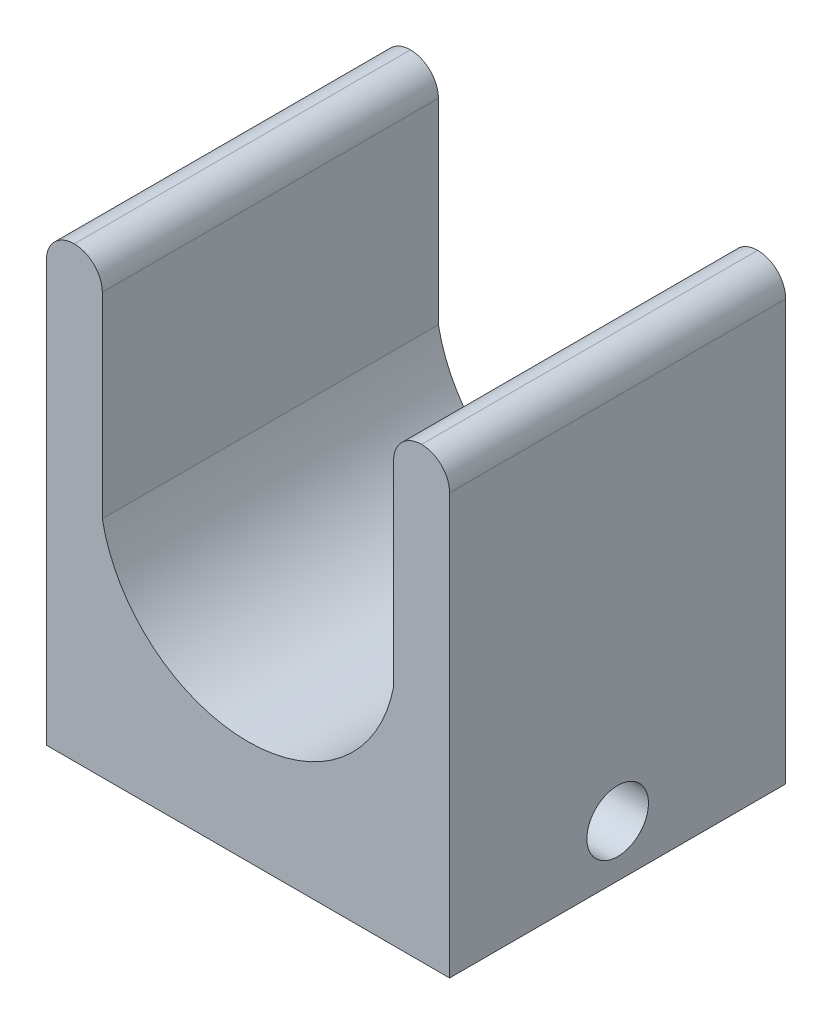
ISO-10303-21;
HEADER;
FILE_DESCRIPTION(('STEP AP214'),'2;1');
FILE_NAME('part.step','',(''),(''),'','','');
FILE_SCHEMA(('AUTOMOTIVE_DESIGN { 1 0 10303 214 1 1 1 1 }'));
ENDSEC;
DATA;
#1=APPLICATION_CONTEXT('core data for automotive mechanical design processes');
#2=APPLICATION_PROTOCOL_DEFINITION('international standard','automotive_design',2000,#1);
#3=PRODUCT_CONTEXT('',#1,'mechanical');
#4=PRODUCT('Part','Part','',(#3));
#5=PRODUCT_RELATED_PRODUCT_CATEGORY('part','',(#4));
#6=PRODUCT_DEFINITION_FORMATION('','',#4);
#7=PRODUCT_DEFINITION_CONTEXT('part definition',#1,'design');
#8=PRODUCT_DEFINITION('design','',#6,#7);
#9=PRODUCT_DEFINITION_SHAPE('','',#8);
#10=(LENGTH_UNIT() NAMED_UNIT(*) SI_UNIT(.MILLI.,.METRE.));
#11=(NAMED_UNIT(*) PLANE_ANGLE_UNIT() SI_UNIT($,.RADIAN.));
#12=(NAMED_UNIT(*) SI_UNIT($,.STERADIAN.) SOLID_ANGLE_UNIT());
#13=UNCERTAINTY_MEASURE_WITH_UNIT(LENGTH_MEASURE(1.E-05),#10,'distance_accuracy_value','');
#14=(GEOMETRIC_REPRESENTATION_CONTEXT(3) GLOBAL_UNCERTAINTY_ASSIGNED_CONTEXT((#13)) GLOBAL_UNIT_ASSIGNED_CONTEXT((#10,
#11,#12)) REPRESENTATION_CONTEXT('',''));
#15=CARTESIAN_POINT('',(0.,0.,0.));
#16=DIRECTION('',(0.,0.,1.));
#17=DIRECTION('',(1.,0.,0.));
#18=AXIS2_PLACEMENT_3D('',#15,#16,#17);
#19=CARTESIAN_POINT('',(-36.,5.66575903543038,60.));
#20=DIRECTION('',(1.,0.,0.));
#21=DIRECTION('',(0.,1.,0.));
#22=AXIS2_PLACEMENT_3D('',#19,#20,#21);
#23=PLANE('',#22);
#24=CARTESIAN_POINT('',(-36.,-25.0643109132314,30.));
#25=DIRECTION('',(1.,0.,0.));
#26=DIRECTION('',(0.,1.,0.));
#27=AXIS2_PLACEMENT_3D('',#24,#25,#26);
#28=CIRCLE('',#27,5.5);
#29=CARTESIAN_POINT('',(-36.,-19.5643109132314,30.));
#30=VERTEX_POINT('',#29);
#31=EDGE_CURVE('E192',#30,#30,#28,.T.);
#32=ORIENTED_EDGE('',*,*,#31,.T.);
#33=EDGE_LOOP('',(#32));
#34=FACE_BOUND('',#33,.T.);
#35=DIRECTION('',(0.,-1.,0.));
#36=VECTOR('',#35,1.);
#37=CARTESIAN_POINT('',(-36.,45.6657590354304,60.));
#38=LINE('',#37,#36);
#39=CARTESIAN_POINT('',(-36.,40.6657590354304,60.));
#40=VERTEX_POINT('',#39);
#41=CARTESIAN_POINT('',(-36.,-34.3342409645696,60.));
#42=VERTEX_POINT('',#41);
#43=EDGE_CURVE('E118',#40,#42,#38,.T.);
#44=ORIENTED_EDGE('',*,*,#43,.F.);
#45=DIRECTION('',(0.,0.,-1.));
#46=VECTOR('',#45,1.);
#47=CARTESIAN_POINT('',(-36.,40.6657590354304,60.));
#48=LINE('',#47,#46);
#49=CARTESIAN_POINT('',(-36.,40.6657590354304,0.));
#50=VERTEX_POINT('',#49);
#51=EDGE_CURVE('E11',#40,#50,#48,.T.);
#52=ORIENTED_EDGE('',*,*,#51,.T.);
#53=DIRECTION('',(0.,-1.,0.));
#54=VECTOR('',#53,1.);
#55=CARTESIAN_POINT('',(-36.,5.66575903543038,0.));
#56=LINE('',#55,#54);
#57=CARTESIAN_POINT('',(-36.,-34.3342409645696,0.));
#58=VERTEX_POINT('',#57);
#59=EDGE_CURVE('E134',#50,#58,#56,.T.);
#60=ORIENTED_EDGE('',*,*,#59,.T.);
#61=DIRECTION('',(0.,0.,-1.));
#62=VECTOR('',#61,1.);
#63=CARTESIAN_POINT('',(-36.,-34.3342409645696,60.));
#64=LINE('',#63,#62);
#65=EDGE_CURVE('E128',#42,#58,#64,.T.);
#66=ORIENTED_EDGE('',*,*,#65,.F.);
#67=EDGE_LOOP('',(#44,#52,#60,#66));
#68=FACE_BOUND('',#67,.T.);
#69=ADVANCED_FACE('F39',(#34,#68),#23,.F.);
#70=CARTESIAN_POINT('',(-36.,-34.3342409645696,60.));
#71=DIRECTION('',(0.,1.,0.));
#72=DIRECTION('',(0.,0.,1.));
#73=AXIS2_PLACEMENT_3D('',#70,#71,#72);
#74=PLANE('',#73);
#75=DIRECTION('',(1.,0.,0.));
#76=VECTOR('',#75,1.);
#77=CARTESIAN_POINT('',(-36.,-34.3342409645696,0.));
#78=LINE('',#77,#76);
#79=CARTESIAN_POINT('',(36.,-34.3342409645696,0.));
#80=VERTEX_POINT('',#79);
#81=EDGE_CURVE('E156',#58,#80,#78,.T.);
#82=ORIENTED_EDGE('',*,*,#81,.T.);
#83=DIRECTION('',(0.,0.,-1.));
#84=VECTOR('',#83,1.);
#85=CARTESIAN_POINT('',(36.,-34.3342409645696,60.));
#86=LINE('',#85,#84);
#87=CARTESIAN_POINT('',(36.,-34.3342409645696,60.));
#88=VERTEX_POINT('',#87);
#89=EDGE_CURVE('E140',#88,#80,#86,.T.);
#90=ORIENTED_EDGE('',*,*,#89,.F.);
#91=DIRECTION('',(1.,0.,0.));
#92=VECTOR('',#91,1.);
#93=CARTESIAN_POINT('',(-36.,-34.3342409645696,60.));
#94=LINE('',#93,#92);
#95=EDGE_CURVE('E123',#42,#88,#94,.T.);
#96=ORIENTED_EDGE('',*,*,#95,.F.);
#97=ORIENTED_EDGE('',*,*,#65,.T.);
#98=EDGE_LOOP('',(#82,#90,#96,#97));
#99=FACE_BOUND('',#98,.T.);
#100=ADVANCED_FACE('F139',(#99),#74,.F.);
#101=CARTESIAN_POINT('',(36.,45.6657590354304,60.));
#102=DIRECTION('',(-1.,0.,0.));
#103=DIRECTION('',(0.,-1.,0.));
#104=AXIS2_PLACEMENT_3D('',#101,#102,#103);
#105=PLANE('',#104);
#106=CARTESIAN_POINT('',(36.,-25.0643109132314,30.));
#107=DIRECTION('',(1.,0.,0.));
#108=DIRECTION('',(0.,1.,0.));
#109=AXIS2_PLACEMENT_3D('',#106,#107,#108);
#110=CIRCLE('',#109,5.5);
#111=CARTESIAN_POINT('',(36.,-19.5643109132314,30.));
#112=VERTEX_POINT('',#111);
#113=EDGE_CURVE('E200',#112,#112,#110,.T.);
#114=ORIENTED_EDGE('',*,*,#113,.F.);
#115=EDGE_LOOP('',(#114));
#116=FACE_BOUND('',#115,.T.);
#117=DIRECTION('',(0.,1.,0.));
#118=VECTOR('',#117,1.);
#119=CARTESIAN_POINT('',(36.,45.6657590354304,0.));
#120=LINE('',#119,#118);
#121=CARTESIAN_POINT('',(36.,40.6657590354304,0.));
#122=VERTEX_POINT('',#121);
#123=EDGE_CURVE('E157',#80,#122,#120,.T.);
#124=ORIENTED_EDGE('',*,*,#123,.T.);
#125=DIRECTION('',(0.,0.,-1.));
#126=VECTOR('',#125,1.);
#127=CARTESIAN_POINT('',(36.,40.6657590354304,60.));
#128=LINE('',#127,#126);
#129=CARTESIAN_POINT('',(36.,40.6657590354304,60.));
#130=VERTEX_POINT('',#129);
#131=EDGE_CURVE('E182',#122,#130,#128,.F.);
#132=ORIENTED_EDGE('',*,*,#131,.T.);
#133=DIRECTION('',(0.,1.,0.));
#134=VECTOR('',#133,1.);
#135=CARTESIAN_POINT('',(36.,-34.3342409645696,60.));
#136=LINE('',#135,#134);
#137=EDGE_CURVE('E142',#88,#130,#136,.T.);
#138=ORIENTED_EDGE('',*,*,#137,.F.);
#139=ORIENTED_EDGE('',*,*,#89,.T.);
#140=EDGE_LOOP('',(#124,#132,#138,#139));
#141=FACE_BOUND('',#140,.T.);
#142=ADVANCED_FACE('F208',(#116,#141),#105,.F.);
#143=CARTESIAN_POINT('',(26.,45.6657590354304,60.));
#144=DIRECTION('',(1.,0.,0.));
#145=DIRECTION('',(0.,1.,0.));
#146=AXIS2_PLACEMENT_3D('',#143,#144,#145);
#147=PLANE('',#146);
#148=DIRECTION('',(0.,-1.,0.));
#149=VECTOR('',#148,1.);
#150=CARTESIAN_POINT('',(26.,45.6657590354304,60.));
#151=LINE('',#150,#149);
#152=CARTESIAN_POINT('',(26.,40.6657590354304,60.));
#153=VERTEX_POINT('',#152);
#154=CARTESIAN_POINT('',(26.,5.66575903543036,60.));
#155=VERTEX_POINT('',#154);
#156=EDGE_CURVE('E145',#153,#155,#151,.T.);
#157=ORIENTED_EDGE('',*,*,#156,.F.);
#158=DIRECTION('',(0.,0.,-1.));
#159=VECTOR('',#158,1.);
#160=CARTESIAN_POINT('',(26.,40.6657590354304,60.));
#161=LINE('',#160,#159);
#162=CARTESIAN_POINT('',(26.,40.6657590354304,0.));
#163=VERTEX_POINT('',#162);
#164=EDGE_CURVE('E190',#153,#163,#161,.T.);
#165=ORIENTED_EDGE('',*,*,#164,.T.);
#166=DIRECTION('',(0.,-1.,0.));
#167=VECTOR('',#166,1.);
#168=CARTESIAN_POINT('',(26.,45.6657590354304,0.));
#169=LINE('',#168,#167);
#170=CARTESIAN_POINT('',(26.,5.66575903543036,0.));
#171=VERTEX_POINT('',#170);
#172=EDGE_CURVE('E165',#163,#171,#169,.T.);
#173=ORIENTED_EDGE('',*,*,#172,.T.);
#174=DIRECTION('',(0.,0.,-1.));
#175=VECTOR('',#174,1.);
#176=CARTESIAN_POINT('',(26.,5.66575903543036,60.));
#177=LINE('',#176,#175);
#178=EDGE_CURVE('E168',#155,#171,#177,.T.);
#179=ORIENTED_EDGE('',*,*,#178,.F.);
#180=EDGE_LOOP('',(#157,#165,#173,#179));
#181=FACE_BOUND('',#180,.T.);
#182=ADVANCED_FACE('F211',(#181),#147,.F.);
#183=CARTESIAN_POINT('',(0.,10.685819403587,60.));
#184=DIRECTION('',(0.,0.,-1.));
#185=DIRECTION('',(-1.,0.,0.));
#186=AXIS2_PLACEMENT_3D('',#183,#184,#185);
#187=CYLINDRICAL_SURFACE('',#186,26.4802002654802);
#188=CARTESIAN_POINT('',(0.,10.685819403587,0.));
#189=DIRECTION('',(0.,0.,-1.));
#190=DIRECTION('',(1.,0.,0.));
#191=AXIS2_PLACEMENT_3D('',#188,#189,#190);
#192=CIRCLE('',#191,26.4802002654802);
#193=CARTESIAN_POINT('',(-26.,5.66575903543038,0.));
#194=VERTEX_POINT('',#193);
#195=EDGE_CURVE('E163',#171,#194,#192,.T.);
#196=ORIENTED_EDGE('',*,*,#195,.T.);
#197=DIRECTION('',(0.,0.,-1.));
#198=VECTOR('',#197,1.);
#199=CARTESIAN_POINT('',(-26.,5.66575903543038,60.));
#200=LINE('',#199,#198);
#201=CARTESIAN_POINT('',(-26.,5.66575903543038,60.));
#202=VERTEX_POINT('',#201);
#203=EDGE_CURVE('E152',#202,#194,#200,.T.);
#204=ORIENTED_EDGE('',*,*,#203,.F.);
#205=CARTESIAN_POINT('',(0.,10.685819403587,60.));
#206=DIRECTION('',(0.,0.,-1.));
#207=DIRECTION('',(1.,0.,0.));
#208=AXIS2_PLACEMENT_3D('',#205,#206,#207);
#209=CIRCLE('',#208,26.4802002654802);
#210=EDGE_CURVE('E149',#155,#202,#209,.T.);
#211=ORIENTED_EDGE('',*,*,#210,.F.);
#212=ORIENTED_EDGE('',*,*,#178,.T.);
#213=EDGE_LOOP('',(#196,#204,#211,#212));
#214=FACE_BOUND('',#213,.T.);
#215=ADVANCED_FACE('F227',(#214),#187,.F.);
#216=CARTESIAN_POINT('',(-26.,45.6657590354304,60.));
#217=DIRECTION('',(-1.,0.,0.));
#218=DIRECTION('',(0.,-1.,0.));
#219=AXIS2_PLACEMENT_3D('',#216,#217,#218);
#220=PLANE('',#219);
#221=DIRECTION('',(0.,1.,0.));
#222=VECTOR('',#221,1.);
#223=CARTESIAN_POINT('',(-26.,45.6657590354304,0.));
#224=LINE('',#223,#222);
#225=CARTESIAN_POINT('',(-26.,40.6657590354304,0.));
#226=VERTEX_POINT('',#225);
#227=EDGE_CURVE('E130',#194,#226,#224,.T.);
#228=ORIENTED_EDGE('',*,*,#227,.T.);
#229=DIRECTION('',(0.,0.,-1.));
#230=VECTOR('',#229,1.);
#231=CARTESIAN_POINT('',(-26.,40.6657590354304,60.));
#232=LINE('',#231,#230);
#233=CARTESIAN_POINT('',(-26.,40.6657590354304,60.));
#234=VERTEX_POINT('',#233);
#235=EDGE_CURVE('E48',#226,#234,#232,.F.);
#236=ORIENTED_EDGE('',*,*,#235,.T.);
#237=DIRECTION('',(0.,1.,0.));
#238=VECTOR('',#237,1.);
#239=CARTESIAN_POINT('',(-26.,45.6657590354304,60.));
#240=LINE('',#239,#238);
#241=EDGE_CURVE('E151',#202,#234,#240,.T.);
#242=ORIENTED_EDGE('',*,*,#241,.F.);
#243=ORIENTED_EDGE('',*,*,#203,.T.);
#244=EDGE_LOOP('',(#228,#236,#242,#243));
#245=FACE_BOUND('',#244,.T.);
#246=ADVANCED_FACE('F235',(#245),#220,.F.);
#247=CARTESIAN_POINT('',(0.,10.685819403587,60.));
#248=DIRECTION('',(0.,0.,1.));
#249=DIRECTION('',(1.,0.,0.));
#250=AXIS2_PLACEMENT_3D('',#247,#248,#249);
#251=PLANE('',#250);
#252=ORIENTED_EDGE('',*,*,#137,.T.);
#253=CARTESIAN_POINT('',(31.,40.6657590354304,60.));
#254=DIRECTION('',(0.,0.,1.));
#255=DIRECTION('',(1.,0.,0.));
#256=AXIS2_PLACEMENT_3D('',#253,#254,#255);
#257=CIRCLE('',#256,5.);
#258=CARTESIAN_POINT('',(31.,45.6657590354304,60.));
#259=VERTEX_POINT('',#258);
#260=EDGE_CURVE('E189',#130,#259,#257,.T.);
#261=ORIENTED_EDGE('',*,*,#260,.T.);
#262=CARTESIAN_POINT('',(31.,40.6657590354304,60.));
#263=DIRECTION('',(0.,0.,1.));
#264=DIRECTION('',(1.,0.,0.));
#265=AXIS2_PLACEMENT_3D('',#262,#263,#264);
#266=CIRCLE('',#265,5.);
#267=EDGE_CURVE('E65',#259,#153,#266,.T.);
#268=ORIENTED_EDGE('',*,*,#267,.T.);
#269=ORIENTED_EDGE('',*,*,#156,.T.);
#270=ORIENTED_EDGE('',*,*,#210,.T.);
#271=ORIENTED_EDGE('',*,*,#241,.T.);
#272=CARTESIAN_POINT('',(-31.,40.6657590354304,60.));
#273=DIRECTION('',(0.,0.,1.));
#274=DIRECTION('',(1.,0.,0.));
#275=AXIS2_PLACEMENT_3D('',#272,#273,#274);
#276=CIRCLE('',#275,5.);
#277=CARTESIAN_POINT('',(-31.,45.6657590354304,60.));
#278=VERTEX_POINT('',#277);
#279=EDGE_CURVE('E57',#234,#278,#276,.T.);
#280=ORIENTED_EDGE('',*,*,#279,.T.);
#281=CARTESIAN_POINT('',(-31.,40.6657590354304,60.));
#282=DIRECTION('',(0.,0.,1.));
#283=DIRECTION('',(1.,0.,0.));
#284=AXIS2_PLACEMENT_3D('',#281,#282,#283);
#285=CIRCLE('',#284,5.);
#286=EDGE_CURVE('E124',#278,#40,#285,.T.);
#287=ORIENTED_EDGE('',*,*,#286,.T.);
#288=ORIENTED_EDGE('',*,*,#43,.T.);
#289=ORIENTED_EDGE('',*,*,#95,.T.);
#290=EDGE_LOOP('',(#252,#261,#268,#269,#270,#271,#280,#287,#288,#289));
#291=FACE_BOUND('',#290,.T.);
#292=ADVANCED_FACE('F120',(#291),#251,.T.);
#293=CARTESIAN_POINT('',(0.,10.685819403587,0.));
#294=DIRECTION('',(0.,0.,1.));
#295=DIRECTION('',(1.,0.,0.));
#296=AXIS2_PLACEMENT_3D('',#293,#294,#295);
#297=PLANE('',#296);
#298=CARTESIAN_POINT('',(31.,40.6657590354304,0.));
#299=DIRECTION('',(0.,0.,1.));
#300=DIRECTION('',(1.,0.,0.));
#301=AXIS2_PLACEMENT_3D('',#298,#299,#300);
#302=CIRCLE('',#301,5.);
#303=CARTESIAN_POINT('',(31.,45.6657590354304,0.));
#304=VERTEX_POINT('',#303);
#305=EDGE_CURVE('E180',#163,#304,#302,.F.);
#306=ORIENTED_EDGE('',*,*,#305,.T.);
#307=CARTESIAN_POINT('',(31.,40.6657590354304,0.));
#308=DIRECTION('',(0.,0.,1.));
#309=DIRECTION('',(1.,0.,0.));
#310=AXIS2_PLACEMENT_3D('',#307,#308,#309);
#311=CIRCLE('',#310,5.);
#312=EDGE_CURVE('E179',#304,#122,#311,.F.);
#313=ORIENTED_EDGE('',*,*,#312,.T.);
#314=ORIENTED_EDGE('',*,*,#123,.F.);
#315=ORIENTED_EDGE('',*,*,#81,.F.);
#316=ORIENTED_EDGE('',*,*,#59,.F.);
#317=CARTESIAN_POINT('',(-31.,40.6657590354304,0.));
#318=DIRECTION('',(0.,0.,1.));
#319=DIRECTION('',(1.,0.,0.));
#320=AXIS2_PLACEMENT_3D('',#317,#318,#319);
#321=CIRCLE('',#320,5.);
#322=CARTESIAN_POINT('',(-31.,45.6657590354304,0.));
#323=VERTEX_POINT('',#322);
#324=EDGE_CURVE('E138',#50,#323,#321,.F.);
#325=ORIENTED_EDGE('',*,*,#324,.T.);
#326=CARTESIAN_POINT('',(-31.,40.6657590354304,0.));
#327=DIRECTION('',(0.,0.,1.));
#328=DIRECTION('',(1.,0.,0.));
#329=AXIS2_PLACEMENT_3D('',#326,#327,#328);
#330=CIRCLE('',#329,5.);
#331=EDGE_CURVE('E171',#323,#226,#330,.F.);
#332=ORIENTED_EDGE('',*,*,#331,.T.);
#333=ORIENTED_EDGE('',*,*,#227,.F.);
#334=ORIENTED_EDGE('',*,*,#195,.F.);
#335=ORIENTED_EDGE('',*,*,#172,.F.);
#336=EDGE_LOOP('',(#306,#313,#314,#315,#316,#325,#332,#333,#334,#335));
#337=FACE_BOUND('',#336,.T.);
#338=ADVANCED_FACE('F221',(#337),#297,.F.);
#339=CARTESIAN_POINT('',(31.,40.6657590354304,60.));
#340=DIRECTION('',(0.,0.,-1.));
#341=DIRECTION('',(-1.,0.,0.));
#342=AXIS2_PLACEMENT_3D('',#339,#340,#341);
#343=CYLINDRICAL_SURFACE('',#342,5.);
#344=ORIENTED_EDGE('',*,*,#164,.F.);
#345=ORIENTED_EDGE('',*,*,#267,.F.);
#346=DIRECTION('',(0.,0.,-1.));
#347=VECTOR('',#346,1.);
#348=CARTESIAN_POINT('',(31.,45.6657590354304,60.));
#349=LINE('',#348,#347);
#350=EDGE_CURVE('E160',#304,#259,#349,.F.);
#351=ORIENTED_EDGE('',*,*,#350,.F.);
#352=ORIENTED_EDGE('',*,*,#305,.F.);
#353=EDGE_LOOP('',(#344,#345,#351,#352));
#354=FACE_BOUND('',#353,.T.);
#355=ADVANCED_FACE('F217',(#354),#343,.T.);
#356=CARTESIAN_POINT('',(31.,40.6657590354304,60.));
#357=DIRECTION('',(0.,0.,-1.));
#358=DIRECTION('',(-1.,0.,0.));
#359=AXIS2_PLACEMENT_3D('',#356,#357,#358);
#360=CYLINDRICAL_SURFACE('',#359,5.);
#361=ORIENTED_EDGE('',*,*,#260,.F.);
#362=ORIENTED_EDGE('',*,*,#131,.F.);
#363=ORIENTED_EDGE('',*,*,#312,.F.);
#364=ORIENTED_EDGE('',*,*,#350,.T.);
#365=EDGE_LOOP('',(#361,#362,#363,#364));
#366=FACE_BOUND('',#365,.T.);
#367=ADVANCED_FACE('F214',(#366),#360,.T.);
#368=CARTESIAN_POINT('',(-31.,40.6657590354304,60.));
#369=DIRECTION('',(0.,0.,-1.));
#370=DIRECTION('',(-1.,0.,0.));
#371=AXIS2_PLACEMENT_3D('',#368,#369,#370);
#372=CYLINDRICAL_SURFACE('',#371,5.);
#373=ORIENTED_EDGE('',*,*,#51,.F.);
#374=ORIENTED_EDGE('',*,*,#286,.F.);
#375=DIRECTION('',(0.,0.,-1.));
#376=VECTOR('',#375,1.);
#377=CARTESIAN_POINT('',(-31.,45.6657590354304,60.));
#378=LINE('',#377,#376);
#379=EDGE_CURVE('E43',#323,#278,#378,.F.);
#380=ORIENTED_EDGE('',*,*,#379,.F.);
#381=ORIENTED_EDGE('',*,*,#324,.F.);
#382=EDGE_LOOP('',(#373,#374,#380,#381));
#383=FACE_BOUND('',#382,.T.);
#384=ADVANCED_FACE('F41',(#383),#372,.T.);
#385=CARTESIAN_POINT('',(-31.,40.6657590354304,60.));
#386=DIRECTION('',(0.,0.,-1.));
#387=DIRECTION('',(-1.,0.,0.));
#388=AXIS2_PLACEMENT_3D('',#385,#386,#387);
#389=CYLINDRICAL_SURFACE('',#388,5.);
#390=ORIENTED_EDGE('',*,*,#279,.F.);
#391=ORIENTED_EDGE('',*,*,#235,.F.);
#392=ORIENTED_EDGE('',*,*,#331,.F.);
#393=ORIENTED_EDGE('',*,*,#379,.T.);
#394=EDGE_LOOP('',(#390,#391,#392,#393));
#395=FACE_BOUND('',#394,.T.);
#396=ADVANCED_FACE('F232',(#395),#389,.T.);
#397=CARTESIAN_POINT('',(-36.,-25.0643109132314,30.));
#398=DIRECTION('',(1.,0.,0.));
#399=DIRECTION('',(0.,1.,0.));
#400=AXIS2_PLACEMENT_3D('',#397,#398,#399);
#401=CYLINDRICAL_SURFACE('',#400,5.5);
#402=ORIENTED_EDGE('',*,*,#31,.F.);
#403=EDGE_LOOP('',(#402));
#404=FACE_BOUND('',#403,.T.);
#405=ORIENTED_EDGE('',*,*,#113,.T.);
#406=EDGE_LOOP('',(#405));
#407=FACE_BOUND('',#406,.T.);
#408=ADVANCED_FACE('F206',(#404,#407),#401,.F.);
#409=CLOSED_SHELL('',(#69,#100,#142,#182,#215,#246,#292,#338,#355,#367,#384,#396,#408));
#410=MANIFOLD_SOLID_BREP('B2',#409);
#411=ADVANCED_BREP_SHAPE_REPRESENTATION('',(#18,#410),#14);
#412=SHAPE_DEFINITION_REPRESENTATION(#9,#411);
ENDSEC;
END-ISO-10303-21;
